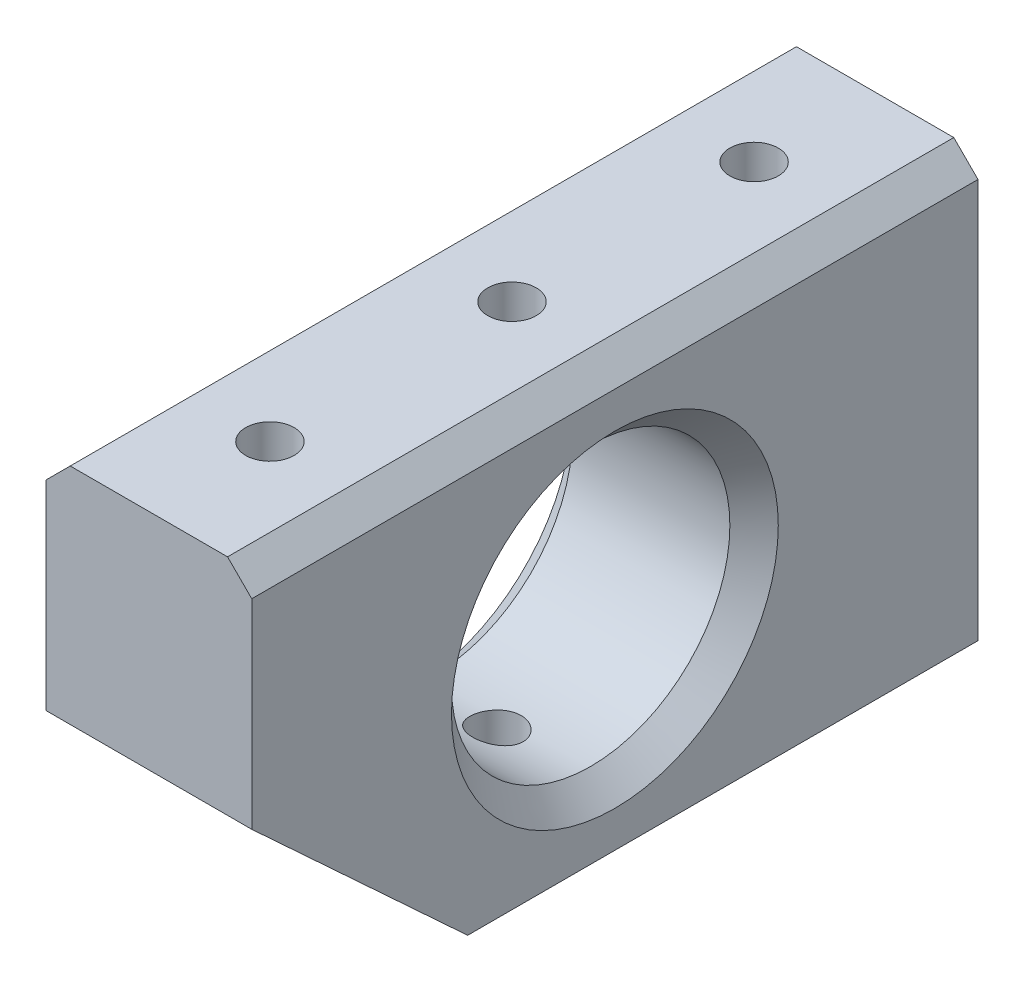
ISO-10303-21;
HEADER;
FILE_DESCRIPTION(('STEP AP214'),'2;1');
FILE_NAME('part.step','',(''),(''),'','','');
FILE_SCHEMA(('AUTOMOTIVE_DESIGN { 1 0 10303 214 1 1 1 1 }'));
ENDSEC;
DATA;
#1=APPLICATION_CONTEXT('core data for automotive mechanical design processes');
#2=APPLICATION_PROTOCOL_DEFINITION('international standard','automotive_design',2000,#1);
#3=PRODUCT_CONTEXT('',#1,'mechanical');
#4=PRODUCT('Part','Part','',(#3));
#5=PRODUCT_RELATED_PRODUCT_CATEGORY('part','',(#4));
#6=PRODUCT_DEFINITION_FORMATION('','',#4);
#7=PRODUCT_DEFINITION_CONTEXT('part definition',#1,'design');
#8=PRODUCT_DEFINITION('design','',#6,#7);
#9=PRODUCT_DEFINITION_SHAPE('','',#8);
#10=(LENGTH_UNIT() NAMED_UNIT(*) SI_UNIT(.MILLI.,.METRE.));
#11=(NAMED_UNIT(*) PLANE_ANGLE_UNIT() SI_UNIT($,.RADIAN.));
#12=(NAMED_UNIT(*) SI_UNIT($,.STERADIAN.) SOLID_ANGLE_UNIT());
#13=UNCERTAINTY_MEASURE_WITH_UNIT(LENGTH_MEASURE(1.E-05),#10,'distance_accuracy_value','');
#14=(GEOMETRIC_REPRESENTATION_CONTEXT(3) GLOBAL_UNCERTAINTY_ASSIGNED_CONTEXT((#13)) GLOBAL_UNIT_ASSIGNED_CONTEXT((#10,
#11,#12)) REPRESENTATION_CONTEXT('',''));
#15=CARTESIAN_POINT('',(0.,0.,0.));
#16=DIRECTION('',(0.,0.,1.));
#17=DIRECTION('',(1.,0.,0.));
#18=AXIS2_PLACEMENT_3D('',#15,#16,#17);
#19=CARTESIAN_POINT('',(0.,0.,76.2));
#20=DIRECTION('',(1.,0.,0.));
#21=DIRECTION('',(0.,0.,-1.));
#22=AXIS2_PLACEMENT_3D('',#19,#20,#21);
#23=PLANE('',#22);
#24=CARTESIAN_POINT('',(0.,23.495,38.1));
#25=DIRECTION('',(1.,0.,0.));
#26=DIRECTION('',(0.,0.,-1.));
#27=AXIS2_PLACEMENT_3D('',#24,#25,#26);
#28=CIRCLE('',#27,17.145);
#29=CARTESIAN_POINT('',(0.,23.495,20.955));
#30=VERTEX_POINT('',#29);
#31=EDGE_CURVE('E170',#30,#30,#28,.T.);
#32=ORIENTED_EDGE('',*,*,#31,.T.);
#33=EDGE_LOOP('',(#32));
#34=FACE_BOUND('',#33,.T.);
#35=DIRECTION('',(0.,-1.,0.));
#36=VECTOR('',#35,1.);
#37=CARTESIAN_POINT('',(0.,0.,76.2));
#38=LINE('',#37,#36);
#39=CARTESIAN_POINT('',(0.,44.45,76.2));
#40=VERTEX_POINT('',#39);
#41=CARTESIAN_POINT('',(0.,23.495,76.2));
#42=VERTEX_POINT('',#41);
#43=EDGE_CURVE('E114',#40,#42,#38,.T.);
#44=ORIENTED_EDGE('',*,*,#43,.F.);
#45=DIRECTION('',(0.,0.,-1.));
#46=VECTOR('',#45,1.);
#47=CARTESIAN_POINT('',(0.,44.45,76.2));
#48=LINE('',#47,#46);
#49=CARTESIAN_POINT('',(0.,44.45,0.));
#50=VERTEX_POINT('',#49);
#51=EDGE_CURVE('E167',#40,#50,#48,.T.);
#52=ORIENTED_EDGE('',*,*,#51,.T.);
#53=DIRECTION('',(0.,-1.,0.));
#54=VECTOR('',#53,1.);
#55=CARTESIAN_POINT('',(0.,0.,0.));
#56=LINE('',#55,#54);
#57=CARTESIAN_POINT('',(0.,2.54000000000001,0.));
#58=VERTEX_POINT('',#57);
#59=EDGE_CURVE('E142',#50,#58,#56,.T.);
#60=ORIENTED_EDGE('',*,*,#59,.T.);
#61=DIRECTION('',(0.,0.,1.));
#62=VECTOR('',#61,1.);
#63=CARTESIAN_POINT('',(0.,2.54000000000001,76.2));
#64=LINE('',#63,#62);
#65=CARTESIAN_POINT('',(0.,2.54000000000001,53.545945945946));
#66=VERTEX_POINT('',#65);
#67=EDGE_CURVE('E134',#58,#66,#64,.T.);
#68=ORIENTED_EDGE('',*,*,#67,.T.);
#69=DIRECTION('',(0.,0.679041981617427,0.734099439586408));
#70=VECTOR('',#69,1.);
#71=CARTESIAN_POINT('',(0.,0.,50.8));
#72=LINE('',#71,#70);
#73=EDGE_CURVE('E131',#66,#42,#72,.T.);
#74=ORIENTED_EDGE('',*,*,#73,.T.);
#75=EDGE_LOOP('',(#44,#52,#60,#68,#74));
#76=FACE_BOUND('',#75,.T.);
#77=ADVANCED_FACE('F41',(#34,#76),#23,.F.);
#78=CARTESIAN_POINT('',(0.,0.,76.2));
#79=DIRECTION('',(0.,1.,0.));
#80=DIRECTION('',(0.,0.,1.));
#81=AXIS2_PLACEMENT_3D('',#78,#79,#80);
#82=PLANE('',#81);
#83=CARTESIAN_POINT('',(10.795,0.,39.6875));
#84=DIRECTION('',(0.,-1.,0.));
#85=DIRECTION('',(0.,0.,-1.));
#86=AXIS2_PLACEMENT_3D('',#83,#84,#85);
#87=CIRCLE('',#86,2.54);
#88=CARTESIAN_POINT('',(10.795,0.,37.1475));
#89=VERTEX_POINT('',#88);
#90=EDGE_CURVE('E352',#89,#89,#87,.T.);
#91=ORIENTED_EDGE('',*,*,#90,.F.);
#92=EDGE_LOOP('',(#91));
#93=FACE_BOUND('',#92,.T.);
#94=CARTESIAN_POINT('',(10.795,0.,12.7));
#95=DIRECTION('',(0.,1.,0.));
#96=DIRECTION('',(0.,0.,1.));
#97=AXIS2_PLACEMENT_3D('',#94,#95,#96);
#98=CIRCLE('',#97,2.54);
#99=CARTESIAN_POINT('',(10.795,0.,15.24));
#100=VERTEX_POINT('',#99);
#101=EDGE_CURVE('E230',#100,#100,#98,.F.);
#102=ORIENTED_EDGE('',*,*,#101,.F.);
#103=EDGE_LOOP('',(#102));
#104=FACE_BOUND('',#103,.T.);
#105=DIRECTION('',(1.,0.,0.));
#106=VECTOR('',#105,1.);
#107=CARTESIAN_POINT('',(0.,0.,50.8));
#108=LINE('',#107,#106);
#109=CARTESIAN_POINT('',(2.54,0.,50.8));
#110=VERTEX_POINT('',#109);
#111=CARTESIAN_POINT('',(19.05,0.,50.8));
#112=VERTEX_POINT('',#111);
#113=EDGE_CURVE('E136',#110,#112,#108,.T.);
#114=ORIENTED_EDGE('',*,*,#113,.F.);
#115=DIRECTION('',(0.,0.,-1.));
#116=VECTOR('',#115,1.);
#117=CARTESIAN_POINT('',(2.54,0.,76.2));
#118=LINE('',#117,#116);
#119=CARTESIAN_POINT('',(2.54,0.,0.));
#120=VERTEX_POINT('',#119);
#121=EDGE_CURVE('E219',#110,#120,#118,.T.);
#122=ORIENTED_EDGE('',*,*,#121,.T.);
#123=DIRECTION('',(1.,0.,0.));
#124=VECTOR('',#123,1.);
#125=CARTESIAN_POINT('',(0.,0.,0.));
#126=LINE('',#125,#124);
#127=CARTESIAN_POINT('',(19.05,0.,0.));
#128=VERTEX_POINT('',#127);
#129=EDGE_CURVE('E146',#120,#128,#126,.T.);
#130=ORIENTED_EDGE('',*,*,#129,.T.);
#131=DIRECTION('',(0.,0.,1.));
#132=VECTOR('',#131,1.);
#133=CARTESIAN_POINT('',(19.05,0.,76.2));
#134=LINE('',#133,#132);
#135=EDGE_CURVE('E58',#128,#112,#134,.T.);
#136=ORIENTED_EDGE('',*,*,#135,.T.);
#137=EDGE_LOOP('',(#114,#122,#130,#136));
#138=FACE_BOUND('',#137,.T.);
#139=ADVANCED_FACE('F235',(#93,#104,#138),#82,.F.);
#140=CARTESIAN_POINT('',(21.59,0.,76.2));
#141=DIRECTION('',(-1.,0.,0.));
#142=DIRECTION('',(0.,0.,1.));
#143=AXIS2_PLACEMENT_3D('',#140,#141,#142);
#144=PLANE('',#143);
#145=CARTESIAN_POINT('',(21.59,23.495,38.1));
#146=DIRECTION('',(-1.,0.,0.));
#147=DIRECTION('',(0.,0.,1.));
#148=AXIS2_PLACEMENT_3D('',#145,#146,#147);
#149=CIRCLE('',#148,17.145);
#150=CARTESIAN_POINT('',(21.59,23.495,55.245));
#151=VERTEX_POINT('',#150);
#152=EDGE_CURVE('E189',#151,#151,#149,.T.);
#153=ORIENTED_EDGE('',*,*,#152,.T.);
#154=EDGE_LOOP('',(#153));
#155=FACE_BOUND('',#154,.T.);
#156=DIRECTION('',(0.,1.,0.));
#157=VECTOR('',#156,1.);
#158=CARTESIAN_POINT('',(21.59,0.,0.));
#159=LINE('',#158,#157);
#160=CARTESIAN_POINT('',(21.59,2.54,0.));
#161=VERTEX_POINT('',#160);
#162=CARTESIAN_POINT('',(21.59,44.45,0.));
#163=VERTEX_POINT('',#162);
#164=EDGE_CURVE('E158',#161,#163,#159,.T.);
#165=ORIENTED_EDGE('',*,*,#164,.T.);
#166=DIRECTION('',(0.,0.,1.));
#167=VECTOR('',#166,1.);
#168=CARTESIAN_POINT('',(21.59,44.45,76.2));
#169=LINE('',#168,#167);
#170=CARTESIAN_POINT('',(21.59,44.45,76.2));
#171=VERTEX_POINT('',#170);
#172=EDGE_CURVE('E186',#163,#171,#169,.T.);
#173=ORIENTED_EDGE('',*,*,#172,.T.);
#174=DIRECTION('',(0.,1.,0.));
#175=VECTOR('',#174,1.);
#176=CARTESIAN_POINT('',(21.59,0.,76.2));
#177=LINE('',#176,#175);
#178=CARTESIAN_POINT('',(21.59,23.495,76.2));
#179=VERTEX_POINT('',#178);
#180=EDGE_CURVE('E128',#179,#171,#177,.T.);
#181=ORIENTED_EDGE('',*,*,#180,.F.);
#182=DIRECTION('',(0.,0.679041981617427,0.734099439586408));
#183=VECTOR('',#182,1.);
#184=CARTESIAN_POINT('',(21.59,0.,50.8));
#185=LINE('',#184,#183);
#186=CARTESIAN_POINT('',(21.59,2.54,53.545945945946));
#187=VERTEX_POINT('',#186);
#188=EDGE_CURVE('E137',#187,#179,#185,.T.);
#189=ORIENTED_EDGE('',*,*,#188,.F.);
#190=DIRECTION('',(0.,0.,-1.));
#191=VECTOR('',#190,1.);
#192=CARTESIAN_POINT('',(21.59,2.54,76.2));
#193=LINE('',#192,#191);
#194=EDGE_CURVE('E182',#187,#161,#193,.T.);
#195=ORIENTED_EDGE('',*,*,#194,.T.);
#196=EDGE_LOOP('',(#165,#173,#181,#189,#195));
#197=FACE_BOUND('',#196,.T.);
#198=ADVANCED_FACE('F227',(#155,#197),#144,.F.);
#199=CARTESIAN_POINT('',(0.,46.99,76.2));
#200=DIRECTION('',(0.,-1.,0.));
#201=DIRECTION('',(0.,0.,-1.));
#202=AXIS2_PLACEMENT_3D('',#199,#200,#201);
#203=PLANE('',#202);
#204=CARTESIAN_POINT('',(10.795,46.99,12.7));
#205=DIRECTION('',(0.,1.,0.));
#206=DIRECTION('',(0.,0.,1.));
#207=AXIS2_PLACEMENT_3D('',#204,#205,#206);
#208=CIRCLE('',#207,2.54);
#209=CARTESIAN_POINT('',(10.795,46.99,15.24));
#210=VERTEX_POINT('',#209);
#211=EDGE_CURVE('E319',#210,#210,#208,.T.);
#212=ORIENTED_EDGE('',*,*,#211,.F.);
#213=EDGE_LOOP('',(#212));
#214=FACE_BOUND('',#213,.T.);
#215=CARTESIAN_POINT('',(10.795,46.99,38.1));
#216=DIRECTION('',(0.,1.,0.));
#217=DIRECTION('',(0.,0.,1.));
#218=AXIS2_PLACEMENT_3D('',#215,#216,#217);
#219=CIRCLE('',#218,2.54);
#220=CARTESIAN_POINT('',(10.795,46.99,40.64));
#221=VERTEX_POINT('',#220);
#222=EDGE_CURVE('E313',#221,#221,#219,.T.);
#223=ORIENTED_EDGE('',*,*,#222,.F.);
#224=EDGE_LOOP('',(#223));
#225=FACE_BOUND('',#224,.T.);
#226=CARTESIAN_POINT('',(10.795,46.99,63.5));
#227=DIRECTION('',(0.,1.,0.));
#228=DIRECTION('',(0.,0.,1.));
#229=AXIS2_PLACEMENT_3D('',#226,#227,#228);
#230=CIRCLE('',#229,2.53999999999999);
#231=CARTESIAN_POINT('',(10.795,46.99,66.04));
#232=VERTEX_POINT('',#231);
#233=EDGE_CURVE('E322',#232,#232,#230,.T.);
#234=ORIENTED_EDGE('',*,*,#233,.F.);
#235=EDGE_LOOP('',(#234));
#236=FACE_BOUND('',#235,.T.);
#237=DIRECTION('',(-1.,0.,0.));
#238=VECTOR('',#237,1.);
#239=CARTESIAN_POINT('',(0.,46.99,0.));
#240=LINE('',#239,#238);
#241=CARTESIAN_POINT('',(19.05,46.99,0.));
#242=VERTEX_POINT('',#241);
#243=CARTESIAN_POINT('',(2.54000000000001,46.99,0.));
#244=VERTEX_POINT('',#243);
#245=EDGE_CURVE('E129',#242,#244,#240,.T.);
#246=ORIENTED_EDGE('',*,*,#245,.T.);
#247=DIRECTION('',(0.,0.,1.));
#248=VECTOR('',#247,1.);
#249=CARTESIAN_POINT('',(2.54000000000001,46.99,76.2));
#250=LINE('',#249,#248);
#251=CARTESIAN_POINT('',(2.54000000000001,46.99,76.2));
#252=VERTEX_POINT('',#251);
#253=EDGE_CURVE('E209',#244,#252,#250,.T.);
#254=ORIENTED_EDGE('',*,*,#253,.T.);
#255=DIRECTION('',(-1.,0.,0.));
#256=VECTOR('',#255,1.);
#257=CARTESIAN_POINT('',(0.,46.99,76.2));
#258=LINE('',#257,#256);
#259=CARTESIAN_POINT('',(19.05,46.99,76.2));
#260=VERTEX_POINT('',#259);
#261=EDGE_CURVE('E153',#260,#252,#258,.T.);
#262=ORIENTED_EDGE('',*,*,#261,.F.);
#263=DIRECTION('',(0.,0.,-1.));
#264=VECTOR('',#263,1.);
#265=CARTESIAN_POINT('',(19.05,46.99,76.2));
#266=LINE('',#265,#264);
#267=EDGE_CURVE('E205',#260,#242,#266,.T.);
#268=ORIENTED_EDGE('',*,*,#267,.T.);
#269=EDGE_LOOP('',(#246,#254,#262,#268));
#270=FACE_BOUND('',#269,.T.);
#271=ADVANCED_FACE('F244',(#214,#225,#236,#270),#203,.F.);
#272=CARTESIAN_POINT('',(0.,0.,76.2));
#273=DIRECTION('',(0.,0.,-1.));
#274=DIRECTION('',(-1.,0.,0.));
#275=AXIS2_PLACEMENT_3D('',#272,#273,#274);
#276=PLANE('',#275);
#277=ORIENTED_EDGE('',*,*,#261,.T.);
#278=DIRECTION('',(0.707106781186548,0.707106781186547,0.));
#279=VECTOR('',#278,1.);
#280=CARTESIAN_POINT('',(0.,44.45,76.2));
#281=LINE('',#280,#279);
#282=EDGE_CURVE('E123',#252,#40,#281,.F.);
#283=ORIENTED_EDGE('',*,*,#282,.T.);
#284=ORIENTED_EDGE('',*,*,#43,.T.);
#285=DIRECTION('',(1.,0.,0.));
#286=VECTOR('',#285,1.);
#287=CARTESIAN_POINT('',(0.,23.495,76.2));
#288=LINE('',#287,#286);
#289=EDGE_CURVE('E120',#42,#179,#288,.T.);
#290=ORIENTED_EDGE('',*,*,#289,.T.);
#291=ORIENTED_EDGE('',*,*,#180,.T.);
#292=DIRECTION('',(0.707106781186545,-0.70710678118655,0.));
#293=VECTOR('',#292,1.);
#294=CARTESIAN_POINT('',(19.05,46.99,76.2));
#295=LINE('',#294,#293);
#296=EDGE_CURVE('E212',#171,#260,#295,.F.);
#297=ORIENTED_EDGE('',*,*,#296,.T.);
#298=EDGE_LOOP('',(#277,#283,#284,#290,#291,#297));
#299=FACE_BOUND('',#298,.T.);
#300=ADVANCED_FACE('F117',(#299),#276,.F.);
#301=CARTESIAN_POINT('',(0.,0.,0.));
#302=DIRECTION('',(0.,0.,-1.));
#303=DIRECTION('',(-1.,0.,0.));
#304=AXIS2_PLACEMENT_3D('',#301,#302,#303);
#305=PLANE('',#304);
#306=ORIENTED_EDGE('',*,*,#59,.F.);
#307=DIRECTION('',(-0.707106781186548,-0.707106781186547,0.));
#308=VECTOR('',#307,1.);
#309=CARTESIAN_POINT('',(-22.225,22.225,0.));
#310=LINE('',#309,#308);
#311=EDGE_CURVE('E202',#50,#244,#310,.F.);
#312=ORIENTED_EDGE('',*,*,#311,.T.);
#313=ORIENTED_EDGE('',*,*,#245,.F.);
#314=DIRECTION('',(-0.707106781186545,0.70710678118655,0.));
#315=VECTOR('',#314,1.);
#316=CARTESIAN_POINT('',(33.0200000000001,33.0199999999998,0.));
#317=LINE('',#316,#315);
#318=EDGE_CURVE('E199',#242,#163,#317,.F.);
#319=ORIENTED_EDGE('',*,*,#318,.T.);
#320=ORIENTED_EDGE('',*,*,#164,.F.);
#321=DIRECTION('',(0.70710678118655,0.707106781186545,0.));
#322=VECTOR('',#321,1.);
#323=CARTESIAN_POINT('',(9.52499999999992,-9.52499999999999,0.));
#324=LINE('',#323,#322);
#325=EDGE_CURVE('E193',#161,#128,#324,.F.);
#326=ORIENTED_EDGE('',*,*,#325,.T.);
#327=ORIENTED_EDGE('',*,*,#129,.F.);
#328=DIRECTION('',(0.707106781186546,-0.707106781186549,0.));
#329=VECTOR('',#328,1.);
#330=CARTESIAN_POINT('',(1.27000000000001,1.27,0.));
#331=LINE('',#330,#329);
#332=EDGE_CURVE('E196',#120,#58,#331,.F.);
#333=ORIENTED_EDGE('',*,*,#332,.T.);
#334=EDGE_LOOP('',(#306,#312,#313,#319,#320,#326,#327,#333));
#335=FACE_BOUND('',#334,.T.);
#336=ADVANCED_FACE('F234',(#335),#305,.T.);
#337=CARTESIAN_POINT('',(0.,23.495,38.1));
#338=DIRECTION('',(1.,0.,0.));
#339=DIRECTION('',(0.,0.,-1.));
#340=AXIS2_PLACEMENT_3D('',#337,#338,#339);
#341=CYLINDRICAL_SURFACE('',#340,14.605);
#342=CARTESIAN_POINT('',(2.54000000000002,23.495,38.1));
#343=DIRECTION('',(1.,0.,0.));
#344=DIRECTION('',(0.,0.,-1.));
#345=AXIS2_PLACEMENT_3D('',#342,#343,#344);
#346=CIRCLE('',#345,14.605);
#347=CARTESIAN_POINT('',(2.54000000000002,23.495,23.495));
#348=VERTEX_POINT('',#347);
#349=EDGE_CURVE('E178',#348,#348,#346,.F.);
#350=ORIENTED_EDGE('',*,*,#349,.T.);
#351=EDGE_LOOP('',(#350));
#352=FACE_BOUND('',#351,.T.);
#353=CARTESIAN_POINT('',(19.05,23.495,38.1));
#354=DIRECTION('',(-1.,0.,0.));
#355=DIRECTION('',(0.,0.,1.));
#356=AXIS2_PLACEMENT_3D('',#353,#354,#355);
#357=CIRCLE('',#356,14.605);
#358=CARTESIAN_POINT('',(19.05,23.495,52.705));
#359=VERTEX_POINT('',#358);
#360=EDGE_CURVE('E174',#359,#359,#357,.F.);
#361=ORIENTED_EDGE('',*,*,#360,.T.);
#362=EDGE_LOOP('',(#361));
#363=FACE_BOUND('',#362,.T.);
#364=CARTESIAN_POINT('',(10.795,8.92109287973881,37.1475));
#365=CARTESIAN_POINT('',(10.6523850935622,8.92109090260096,37.1475054147421));
#366=CARTESIAN_POINT('',(10.5096951637205,8.92028996372938,37.1595490508785));
#367=CARTESIAN_POINT('',(10.2282865074597,8.91728193400107,37.2074109318681));
#368=CARTESIAN_POINT('',(10.0895714176374,8.91507359589412,37.243250265868));
#369=CARTESIAN_POINT('',(9.82018691917144,8.90983279789581,37.3376713072708));
#370=CARTESIAN_POINT('',(9.68951399655673,8.90680070112132,37.3962429990024));
#371=CARTESIAN_POINT('',(9.43986482237357,8.90079030996006,37.5344636485128));
#372=CARTESIAN_POINT('',(9.32088674435303,8.89781200723145,37.6141093078513));
#373=CARTESIAN_POINT('',(9.09781817179331,8.89296884799788,37.7923534907607));
#374=CARTESIAN_POINT('',(8.99374635391311,8.89110537919028,37.8909754343262));
#375=CARTESIAN_POINT('',(8.80363674779435,8.88961197329413,38.1043119946374));
#376=CARTESIAN_POINT('',(8.71759875273139,8.88998201058872,38.2190264267981));
#377=CARTESIAN_POINT('',(8.56635467256365,8.89395802345448,38.46072529695));
#378=CARTESIAN_POINT('',(8.50106158970268,8.89755023699361,38.587655504712));
#379=CARTESIAN_POINT('',(8.39266289947711,8.90870274589156,38.8504923257101));
#380=CARTESIAN_POINT('',(8.3495557874361,8.91626277207881,38.9863983294925));
#381=CARTESIAN_POINT('',(8.28690324532205,8.93566177641183,39.2621768171101));
#382=CARTESIAN_POINT('',(8.26718659686202,8.94746882523413,39.4020127093658));
#383=CARTESIAN_POINT('',(8.25112017498849,8.9753135657713,39.6825947979877));
#384=CARTESIAN_POINT('',(8.25477080812071,8.99135133108785,39.8233410101491));
#385=CARTESIAN_POINT('',(8.28518511586819,9.02724881269866,40.1025267976475));
#386=CARTESIAN_POINT('',(8.31206408295948,9.04712720900944,40.2409513503427));
#387=CARTESIAN_POINT('',(8.38812813428445,9.08974076150076,40.5110671134375));
#388=CARTESIAN_POINT('',(8.43731605827329,9.11247628110424,40.6427574642505));
#389=CARTESIAN_POINT('',(8.55778700749539,9.16004731510226,40.8986521442471));
#390=CARTESIAN_POINT('',(8.62950783102445,9.18491664434546,41.0226441123324));
#391=CARTESIAN_POINT('',(8.79271934569216,9.23475109336981,41.2568471847537));
#392=CARTESIAN_POINT('',(8.88421270308773,9.25971622562327,41.3670564273701));
#393=CARTESIAN_POINT('',(9.0861149596177,9.30836142817523,41.5722635031265));
#394=CARTESIAN_POINT('',(9.19678481657527,9.33201688010012,41.667010871152));
#395=CARTESIAN_POINT('',(9.43315539761811,9.37577838194324,41.8364811132878));
#396=CARTESIAN_POINT('',(9.55885479706364,9.39588474427685,41.9112057502375));
#397=CARTESIAN_POINT('',(9.81970399998482,9.43054854959243,42.0371883277382));
#398=CARTESIAN_POINT('',(9.95466945718547,9.44518997754032,42.0888041074723));
#399=CARTESIAN_POINT('',(10.2318931204709,9.46805513327691,42.1684866877494));
#400=CARTESIAN_POINT('',(10.3741493144607,9.47628062167828,42.196559948808));
#401=CARTESIAN_POINT('',(10.6563273107826,9.4853701472308,42.2275351273953));
#402=CARTESIAN_POINT('',(10.7961444106855,9.48649224359478,42.2313195086325));
#403=CARTESIAN_POINT('',(11.0743871795782,9.48196253051675,42.215928713572));
#404=CARTESIAN_POINT('',(11.2128129805263,9.47631136971887,42.1967557357966));
#405=CARTESIAN_POINT('',(11.482196570189,9.45887592192606,42.136606709945));
#406=CARTESIAN_POINT('',(11.6132358772529,9.44718613791122,42.0959664053007));
#407=CARTESIAN_POINT('',(11.866609346728,9.41869831174642,41.9944217050089));
#408=CARTESIAN_POINT('',(11.9889424989397,9.40189967799097,41.9335149624283));
#409=CARTESIAN_POINT('',(12.2246358573047,9.3640470223518,41.7915709102957));
#410=CARTESIAN_POINT('',(12.3377134570969,9.34290129468409,41.7100892776523));
#411=CARTESIAN_POINT('',(12.5488047596616,9.29819363459787,41.5300585396973));
#412=CARTESIAN_POINT('',(12.6468154819048,9.27463122564454,41.4315060656118));
#413=CARTESIAN_POINT('',(12.8285532759888,9.22586657648811,41.2161584193023));
#414=CARTESIAN_POINT('',(12.9116592698586,9.2006358066947,41.0988448966066));
#415=CARTESIAN_POINT('',(13.0570008721162,9.15102180094321,40.8517589862743));
#416=CARTESIAN_POINT('',(13.1192348958575,9.1266386294626,40.7219856536229));
#417=CARTESIAN_POINT('',(13.2215376537948,9.0799810989352,40.4520591402333));
#418=CARTESIAN_POINT('',(13.2613762590174,9.05773051634326,40.3118143906709));
#419=CARTESIAN_POINT('',(13.3165341697871,9.01684109332604,40.0260716648814));
#420=CARTESIAN_POINT('',(13.3318562644013,8.99820184227763,39.8805742881338));
#421=CARTESIAN_POINT('',(13.3372217290619,8.96561486602611,39.5912433071892));
#422=CARTESIAN_POINT('',(13.3277155494956,8.95158866781457,39.4474269537599));
#423=CARTESIAN_POINT('',(13.2844361996651,8.92804592829446,39.1631178089595));
#424=CARTESIAN_POINT('',(13.250665689854,8.91852889277034,39.0226246549618));
#425=CARTESIAN_POINT('',(13.1605828690117,8.90393061056502,38.7517600100463));
#426=CARTESIAN_POINT('',(13.1047045059029,8.89876963861714,38.6212482490601));
#427=CARTESIAN_POINT('',(12.9719663222004,8.89198373776263,38.3712772221521));
#428=CARTESIAN_POINT('',(12.8951071597858,8.89035869794622,38.2518176096758));
#429=CARTESIAN_POINT('',(12.722693966422,8.88974900730196,38.0275050630407));
#430=CARTESIAN_POINT('',(12.6271645952085,8.89076089511352,37.9226331707274));
#431=CARTESIAN_POINT('',(12.4200012546775,8.89436406060271,37.7302163370409));
#432=CARTESIAN_POINT('',(12.3083637490635,8.89695568549156,37.6426752104108));
#433=CARTESIAN_POINT('',(12.0711448900178,8.90267029121105,37.486733784723));
#434=CARTESIAN_POINT('',(11.9454571335692,8.90579743754694,37.4184955965695));
#435=CARTESIAN_POINT('',(11.6844913009257,8.91158988294364,37.3040845568295));
#436=CARTESIAN_POINT('',(11.5492216843442,8.91425558241714,37.2578925132852));
#437=CARTESIAN_POINT('',(11.3104665305615,8.91784755983891,37.1981878842552));
#438=CARTESIAN_POINT('',(11.2083164931224,8.91904955285242,37.1792088683272));
#439=CARTESIAN_POINT('',(11.0024575364484,8.92067293123741,37.1538629683398));
#440=CARTESIAN_POINT('',(10.8987486201016,8.92109431805495,37.1474960609165));
#441=CARTESIAN_POINT('',(10.795,8.92109287973881,37.1475));
#442=B_SPLINE_CURVE_WITH_KNOTS('',3,(#364,#365,#366,#367,#368,#369,#370,#371,#372,#373,#374,
#375,#376,#377,#378,#379,#380,#381,#382,#383,#384,#385,#386,#387,#388,#389,#390,#391,#392,#393,
#394,#395,#396,#397,#398,#399,#400,#401,#402,#403,#404,#405,#406,#407,#408,#409,#410,#411,#412,
#413,#414,#415,#416,#417,#418,#419,#420,#421,#422,#423,#424,#425,#426,#427,#428,#429,#430,#431,
#432,#433,#434,#435,#436,#437,#438,#439,#440,#441),.UNSPECIFIED.,.T.,.F.,(4,2,2,2,2,2,2,2,2,2,2,
2,2,2,2,2,2,2,2,2,2,2,2,2,2,2,2,2,2,2,2,2,2,2,2,2,2,2,4),(0.,0.42746901178995,0.855317378352818,
1.28297745239856,1.7105706298004,2.13869495534646,2.56681437059688,2.99311393328661,
3.41938458007034,3.84251528117365,4.2656533439568,4.69090376965294,5.11620834159056,
5.55034866068417,5.9845475586483,6.42520070044189,6.86581503353665,7.29934813731804,
7.73276223239302,8.15033590011241,8.56786958189079,8.97905848559487,9.3902950231718,
9.81131220368843,10.2324125629342,10.6682730791309,11.1041666793425,11.5444611496465,
11.9847055272524,12.417018425231,12.8492839296633,13.2734550466627,13.6976128587108,
14.1212141809401,14.5449086403075,14.9720623573748,15.3988435405095,15.7098166594786,
16.0207892023716),.UNSPECIFIED.);
#443=CARTESIAN_POINT('',(10.795,8.92109287973881,37.1475));
#444=VERTEX_POINT('',#443);
#445=EDGE_CURVE('E307',#444,#444,#442,.T.);
#446=ORIENTED_EDGE('',*,*,#445,.F.);
#447=EDGE_LOOP('',(#446));
#448=FACE_BOUND('',#447,.T.);
#449=CARTESIAN_POINT('',(10.795,37.8774345991908,40.64));
#450=CARTESIAN_POINT('',(10.6534894613377,37.877437225139,40.639994394187));
#451=CARTESIAN_POINT('',(10.5119039330996,37.8795457581309,40.6281340003201));
#452=CARTESIAN_POINT('',(10.2327121133975,37.8877434460224,40.5810302035264));
#453=CARTESIAN_POINT('',(10.0951095087486,37.8938361731489,40.545765816165));
#454=CARTESIAN_POINT('',(9.82796416411036,37.9092917962681,40.4529586647047));
#455=CARTESIAN_POINT('',(9.69841454316152,37.9186518539164,40.3954352324445));
#456=CARTESIAN_POINT('',(9.45081724766371,37.939584141011,40.2597920960115));
#457=CARTESIAN_POINT('',(9.33276841411124,37.9511561471972,40.1816744701859));
#458=CARTESIAN_POINT('',(9.11024559996051,37.9753470846111,40.0061671779378));
#459=CARTESIAN_POINT('',(9.00591283702061,37.9879750008682,39.9085996771568));
#460=CARTESIAN_POINT('',(8.81501165534651,38.0127752512497,39.6973465669794));
#461=CARTESIAN_POINT('',(8.72844432649516,38.0249475573857,39.5836599694234));
#462=CARTESIAN_POINT('',(8.57499750008719,38.0475605956396,39.3424764633757));
#463=CARTESIAN_POINT('',(8.50825002264873,38.057989522675,39.2148943590605));
#464=CARTESIAN_POINT('',(8.39718684994073,38.0758405568064,38.9501166602087));
#465=CARTESIAN_POINT('',(8.35286956758827,38.0832628766321,38.8129217466233));
#466=CARTESIAN_POINT('',(8.28835834623439,38.094200960219,38.534273494058));
#467=CARTESIAN_POINT('',(8.26792684473814,38.0977551703508,38.392876688244));
#468=CARTESIAN_POINT('',(8.2510279420762,38.1006888066046,38.1086203204646));
#469=CARTESIAN_POINT('',(8.2545587739559,38.1000685405477,37.9657608671288));
#470=CARTESIAN_POINT('',(8.28530007382919,38.0947534150953,37.6842603757787));
#471=CARTESIAN_POINT('',(8.31225483545621,38.0901025569858,37.5455904632985));
#472=CARTESIAN_POINT('',(8.38867560795726,38.077297963488,37.274772312283));
#473=CARTESIAN_POINT('',(8.43814235126309,38.0691441141297,37.1426242860936));
#474=CARTESIAN_POINT('',(8.55843350201919,38.0501752302267,36.8878469391134));
#475=CARTESIAN_POINT('',(8.6293622165929,38.0393472474917,36.7652678694682));
#476=CARTESIAN_POINT('',(8.79048734450471,38.0162312723324,36.5336555514707));
#477=CARTESIAN_POINT('',(8.88068545203165,38.0039431515731,36.4246234955227));
#478=CARTESIAN_POINT('',(9.07920420096749,37.9790801482294,36.2216879580677));
#479=CARTESIAN_POINT('',(9.18774841624426,37.9665036216447,36.1280032544731));
#480=CARTESIAN_POINT('',(9.41912778661217,37.9426375758928,35.9601392077568));
#481=CARTESIAN_POINT('',(9.54196309725268,37.9313480707366,35.8859600769694));
#482=CARTESIAN_POINT('',(9.79870366541938,37.9113329146698,35.7591634136972));
#483=CARTESIAN_POINT('',(9.93262310857349,37.9026106164012,35.7065740412842));
#484=CARTESIAN_POINT('',(10.2075812744332,37.8887714228487,35.6246999785617));
#485=CARTESIAN_POINT('',(10.3486193093797,37.883654179976,35.5954130414649));
#486=CARTESIAN_POINT('',(10.6318484906622,37.8776722753731,35.5612870522335));
#487=CARTESIAN_POINT('',(10.7740008488125,37.8767532271219,35.5561353123443));
#488=CARTESIAN_POINT('',(11.0571358983939,37.8791266826915,35.5695910382285));
#489=CARTESIAN_POINT('',(11.198118638954,37.8824190087053,35.5881975009148));
#490=CARTESIAN_POINT('',(11.4739076194749,37.8927938641105,35.6483742378865));
#491=CARTESIAN_POINT('',(11.6087500223963,37.8998498506087,35.6897837609698));
#492=CARTESIAN_POINT('',(11.8695818979836,37.9169345254547,35.7942219049687));
#493=CARTESIAN_POINT('',(11.9955707985091,37.9269634057018,35.8572519215213));
#494=CARTESIAN_POINT('',(12.236506231926,37.9489893947989,36.0038736919739));
#495=CARTESIAN_POINT('',(12.3513296642266,37.9610051932154,36.0876648712792));
#496=CARTESIAN_POINT('',(12.5653987002631,37.9855971906442,36.2731583433482));
#497=CARTESIAN_POINT('',(12.6646431057626,37.9981734326665,36.3748620125475));
#498=CARTESIAN_POINT('',(12.8458875417163,38.0226422473539,36.5946826049573));
#499=CARTESIAN_POINT('',(12.9276784449127,38.0345254095078,36.7129731642737));
#500=CARTESIAN_POINT('',(13.0702256084138,38.0561157887693,36.9617977655555));
#501=CARTESIAN_POINT('',(13.1309825947014,38.0658230809726,37.0923313847555));
#502=CARTESIAN_POINT('',(13.2294159453592,38.0819272148172,37.3613300915254));
#503=CARTESIAN_POINT('',(13.267199477517,38.0883394055736,37.4997550050985));
#504=CARTESIAN_POINT('',(13.3189575118369,38.097195949435,37.7811066274819));
#505=CARTESIAN_POINT('',(13.3329341549744,38.0996406593384,37.9240329303005));
#506=CARTESIAN_POINT('',(13.3366157111614,38.1002810586663,38.2083161240717));
#507=CARTESIAN_POINT('',(13.326638017423,38.0985323114513,38.3496688791817));
#508=CARTESIAN_POINT('',(13.2833835294766,38.0910963905044,38.6286521783982));
#509=CARTESIAN_POINT('',(13.2501068949639,38.085409243767,38.7662827480104));
#510=CARTESIAN_POINT('',(13.1613250250405,38.0707338972076,39.033777959725));
#511=CARTESIAN_POINT('',(13.105849073515,38.0617500474706,39.163652574612));
#512=CARTESIAN_POINT('',(12.9742795135096,38.0414592351997,39.4122988710915));
#513=CARTESIAN_POINT('',(12.8981847890565,38.0301521469306,39.5310699512467));
#514=CARTESIAN_POINT('',(12.7264233896014,38.006289330988,39.7557309646829));
#515=CARTESIAN_POINT('',(12.6305252963483,37.9937198354236,39.8614425278039));
#516=CARTESIAN_POINT('',(12.4223634734343,37.968841298241,40.0553842597325));
#517=CARTESIAN_POINT('',(12.3100959138636,37.9565323183487,40.1436103260881));
#518=CARTESIAN_POINT('',(12.0713412347266,37.933464580246,40.300712934711));
#519=CARTESIAN_POINT('',(11.9447502349535,37.9227186344235,40.3694335187338));
#520=CARTESIAN_POINT('',(11.6816818555817,37.9041458889107,40.4845265586458));
#521=CARTESIAN_POINT('',(11.5452143233369,37.8963162281624,40.530920931067));
#522=CARTESIAN_POINT('',(11.3060471524399,37.8861645030813,40.5901837335398));
#523=CARTESIAN_POINT('',(11.2047805271339,37.882909400062,40.6088341890727));
#524=CARTESIAN_POINT('',(11.0006891206188,37.8785435161615,40.6337442300217));
#525=CARTESIAN_POINT('',(10.89786437208,37.8774326903823,40.6400040748798));
#526=CARTESIAN_POINT('',(10.795,37.8774345991908,40.64));
#527=B_SPLINE_CURVE_WITH_KNOTS('',3,(#449,#450,#451,#452,#453,#454,#455,#456,#457,#458,#459,
#460,#461,#462,#463,#464,#465,#466,#467,#468,#469,#470,#471,#472,#473,#474,#475,#476,#477,#478,
#479,#480,#481,#482,#483,#484,#485,#486,#487,#488,#489,#490,#491,#492,#493,#494,#495,#496,#497,
#498,#499,#500,#501,#502,#503,#504,#505,#506,#507,#508,#509,#510,#511,#512,#513,#514,#515,#516,
#517,#518,#519,#520,#521,#522,#523,#524,#525,#526),.UNSPECIFIED.,.T.,.F.,(4,2,2,2,2,2,2,2,2,2,2,
2,2,2,2,2,2,2,2,2,2,2,2,2,2,2,2,2,2,2,2,2,2,2,2,2,2,2,4),(0.,0.42415536979697,0.848691559522952,
1.27285986682514,1.69698538382382,2.12518303293323,2.55340694348122,2.98442236882532,
3.41540729274565,3.84206825590902,4.2686977579306,4.69072766274841,5.11277129937503,
5.53689998181104,5.96106596952255,6.39083290295972,6.8206045145712,7.25093492077063,
7.68122383010227,8.10592234897721,8.53060293738945,8.95232735122339,9.37407899316052,
9.80005057776811,10.2260549092749,10.6569079057873,11.0877460299821,11.5165586219057,
11.9453326482854,12.3684568729456,12.7915781974634,13.2141431983556,13.6367310747833,
14.064569230735,14.4925076476665,14.9237770520301,15.3546222326626,15.6629483105683,
15.9712679324916),.UNSPECIFIED.);
#528=CARTESIAN_POINT('',(10.795,37.8774345991908,40.64));
#529=VERTEX_POINT('',#528);
#530=EDGE_CURVE('E310',#529,#529,#527,.T.);
#531=ORIENTED_EDGE('',*,*,#530,.F.);
#532=EDGE_LOOP('',(#531));
#533=FACE_BOUND('',#532,.T.);
#534=ADVANCED_FACE('F299',(#352,#363,#448,#533),#341,.F.);
#535=CARTESIAN_POINT('',(0.,0.,50.8));
#536=DIRECTION('',(0.,0.734099439586408,-0.679041981617427));
#537=DIRECTION('',(0.,0.679041981617427,0.734099439586408));
#538=AXIS2_PLACEMENT_3D('',#535,#536,#537);
#539=PLANE('',#538);
#540=CARTESIAN_POINT('',(10.795,11.7475,63.5));
#541=DIRECTION('',(0.,0.734099439586408,-0.679041981617427));
#542=DIRECTION('',(0.,0.679041981617427,0.734099439586408));
#543=AXIS2_PLACEMENT_3D('',#540,#541,#542);
#544=ELLIPSE('',#543,3.46002171235961,2.53999999999999);
#545=CARTESIAN_POINT('',(10.795,14.097,66.04));
#546=VERTEX_POINT('',#545);
#547=EDGE_CURVE('E314',#546,#546,#544,.F.);
#548=ORIENTED_EDGE('',*,*,#547,.F.);
#549=EDGE_LOOP('',(#548));
#550=FACE_BOUND('',#549,.T.);
#551=ORIENTED_EDGE('',*,*,#73,.F.);
#552=DIRECTION('',(-0.561767939698273,0.561767939698276,0.607316691565704));
#553=VECTOR('',#552,1.);
#554=CARTESIAN_POINT('',(-6.12574458275701,8.66574458275706,60.1683725218995));
#555=LINE('',#554,#553);
#556=EDGE_CURVE('E11',#66,#110,#555,.F.);
#557=ORIENTED_EDGE('',*,*,#556,.T.);
#558=ORIENTED_EDGE('',*,*,#113,.T.);
#559=DIRECTION('',(-0.561767939698278,-0.561767939698274,-0.607316691565701));
#560=VECTOR('',#559,1.);
#561=CARTESIAN_POINT('',(29.3189073305671,10.268907330567,61.9015214384509));
#562=LINE('',#561,#560);
#563=EDGE_CURVE('E51',#112,#187,#562,.F.);
#564=ORIENTED_EDGE('',*,*,#563,.T.);
#565=ORIENTED_EDGE('',*,*,#188,.T.);
#566=ORIENTED_EDGE('',*,*,#289,.F.);
#567=EDGE_LOOP('',(#551,#557,#558,#564,#565,#566));
#568=FACE_BOUND('',#567,.T.);
#569=ADVANCED_FACE('F139',(#550,#568),#539,.F.);
#570=CARTESIAN_POINT('',(10.795,-0.001000000000001,63.5));
#571=DIRECTION('',(0.,1.,0.));
#572=DIRECTION('',(0.,0.,1.));
#573=AXIS2_PLACEMENT_3D('',#570,#571,#572);
#574=CYLINDRICAL_SURFACE('',#573,2.53999999999999);
#575=ORIENTED_EDGE('',*,*,#233,.T.);
#576=EDGE_LOOP('',(#575));
#577=FACE_BOUND('',#576,.T.);
#578=ORIENTED_EDGE('',*,*,#547,.T.);
#579=EDGE_LOOP('',(#578));
#580=FACE_BOUND('',#579,.T.);
#581=ADVANCED_FACE('F373',(#577,#580),#574,.F.);
#582=CARTESIAN_POINT('',(10.795,-0.001000000000001,38.1));
#583=DIRECTION('',(0.,1.,0.));
#584=DIRECTION('',(0.,0.,1.));
#585=AXIS2_PLACEMENT_3D('',#582,#583,#584);
#586=CYLINDRICAL_SURFACE('',#585,2.54);
#587=ORIENTED_EDGE('',*,*,#222,.T.);
#588=EDGE_LOOP('',(#587));
#589=FACE_BOUND('',#588,.T.);
#590=ORIENTED_EDGE('',*,*,#530,.T.);
#591=EDGE_LOOP('',(#590));
#592=FACE_BOUND('',#591,.T.);
#593=ADVANCED_FACE('F332',(#589,#592),#586,.F.);
#594=CARTESIAN_POINT('',(10.795,-0.001000000000001,12.7));
#595=DIRECTION('',(0.,1.,0.));
#596=DIRECTION('',(0.,0.,1.));
#597=AXIS2_PLACEMENT_3D('',#594,#595,#596);
#598=CYLINDRICAL_SURFACE('',#597,2.54);
#599=ORIENTED_EDGE('',*,*,#211,.T.);
#600=EDGE_LOOP('',(#599));
#601=FACE_BOUND('',#600,.T.);
#602=ORIENTED_EDGE('',*,*,#101,.T.);
#603=EDGE_LOOP('',(#602));
#604=FACE_BOUND('',#603,.T.);
#605=ADVANCED_FACE('F337',(#601,#604),#598,.F.);
#606=CARTESIAN_POINT('',(10.795,46.991,39.6875));
#607=DIRECTION('',(0.,-1.,0.));
#608=DIRECTION('',(0.,0.,-1.));
#609=AXIS2_PLACEMENT_3D('',#606,#607,#608);
#610=CYLINDRICAL_SURFACE('',#609,2.54);
#611=ORIENTED_EDGE('',*,*,#90,.T.);
#612=EDGE_LOOP('',(#611));
#613=FACE_BOUND('',#612,.T.);
#614=ORIENTED_EDGE('',*,*,#445,.T.);
#615=EDGE_LOOP('',(#614));
#616=FACE_BOUND('',#615,.T.);
#617=ADVANCED_FACE('F277',(#613,#616),#610,.F.);
#618=CARTESIAN_POINT('',(0.,23.495,38.1));
#619=DIRECTION('',(-1.,0.,0.));
#620=DIRECTION('',(0.,0.,1.));
#621=AXIS2_PLACEMENT_3D('',#618,#619,#620);
#622=CONICAL_SURFACE('',#621,17.145,0.785398163397448);
#623=ORIENTED_EDGE('',*,*,#349,.F.);
#624=EDGE_LOOP('',(#623));
#625=FACE_BOUND('',#624,.T.);
#626=ORIENTED_EDGE('',*,*,#31,.F.);
#627=EDGE_LOOP('',(#626));
#628=FACE_BOUND('',#627,.T.);
#629=ADVANCED_FACE('F271',(#625,#628),#622,.F.);
#630=CARTESIAN_POINT('',(19.05,23.495,38.1));
#631=DIRECTION('',(1.,0.,0.));
#632=DIRECTION('',(0.,0.,-1.));
#633=AXIS2_PLACEMENT_3D('',#630,#631,#632);
#634=CONICAL_SURFACE('',#633,14.605,0.785398163397451);
#635=ORIENTED_EDGE('',*,*,#152,.F.);
#636=EDGE_LOOP('',(#635));
#637=FACE_BOUND('',#636,.T.);
#638=ORIENTED_EDGE('',*,*,#360,.F.);
#639=EDGE_LOOP('',(#638));
#640=FACE_BOUND('',#639,.T.);
#641=ADVANCED_FACE('F257',(#637,#640),#634,.F.);
#642=CARTESIAN_POINT('',(0.,44.45,76.2));
#643=DIRECTION('',(0.707106781186547,-0.707106781186548,0.));
#644=DIRECTION('',(0.,0.,-1.));
#645=AXIS2_PLACEMENT_3D('',#642,#643,#644);
#646=PLANE('',#645);
#647=ORIENTED_EDGE('',*,*,#282,.F.);
#648=ORIENTED_EDGE('',*,*,#253,.F.);
#649=ORIENTED_EDGE('',*,*,#311,.F.);
#650=ORIENTED_EDGE('',*,*,#51,.F.);
#651=EDGE_LOOP('',(#647,#648,#649,#650));
#652=FACE_BOUND('',#651,.T.);
#653=ADVANCED_FACE('F240',(#652),#646,.F.);
#654=CARTESIAN_POINT('',(19.05,46.99,76.2));
#655=DIRECTION('',(-0.70710678118655,-0.707106781186545,0.));
#656=DIRECTION('',(0.,0.,-1.));
#657=AXIS2_PLACEMENT_3D('',#654,#655,#656);
#658=PLANE('',#657);
#659=ORIENTED_EDGE('',*,*,#296,.F.);
#660=ORIENTED_EDGE('',*,*,#172,.F.);
#661=ORIENTED_EDGE('',*,*,#318,.F.);
#662=ORIENTED_EDGE('',*,*,#267,.F.);
#663=EDGE_LOOP('',(#659,#660,#661,#662));
#664=FACE_BOUND('',#663,.T.);
#665=ADVANCED_FACE('F249',(#664),#658,.F.);
#666=CARTESIAN_POINT('',(2.54,0.,76.2));
#667=DIRECTION('',(0.707106781186549,0.707106781186546,0.));
#668=DIRECTION('',(0.,0.,-1.));
#669=AXIS2_PLACEMENT_3D('',#666,#667,#668);
#670=PLANE('',#669);
#671=ORIENTED_EDGE('',*,*,#556,.F.);
#672=ORIENTED_EDGE('',*,*,#67,.F.);
#673=ORIENTED_EDGE('',*,*,#332,.F.);
#674=ORIENTED_EDGE('',*,*,#121,.F.);
#675=EDGE_LOOP('',(#671,#672,#673,#674));
#676=FACE_BOUND('',#675,.T.);
#677=ADVANCED_FACE('F238',(#676),#670,.F.);
#678=CARTESIAN_POINT('',(21.59,2.54,76.2));
#679=DIRECTION('',(-0.707106781186545,0.70710678118655,0.));
#680=DIRECTION('',(0.,0.,-1.));
#681=AXIS2_PLACEMENT_3D('',#678,#679,#680);
#682=PLANE('',#681);
#683=ORIENTED_EDGE('',*,*,#563,.F.);
#684=ORIENTED_EDGE('',*,*,#135,.F.);
#685=ORIENTED_EDGE('',*,*,#325,.F.);
#686=ORIENTED_EDGE('',*,*,#194,.F.);
#687=EDGE_LOOP('',(#683,#684,#685,#686));
#688=FACE_BOUND('',#687,.T.);
#689=ADVANCED_FACE('F44',(#688),#682,.F.);
#690=CLOSED_SHELL('',(#77,#139,#198,#271,#300,#336,#534,#569,#581,#593,#605,#617,#629,#641,#653,
#665,#677,#689));
#691=MANIFOLD_SOLID_BREP('B2',#690);
#692=ADVANCED_BREP_SHAPE_REPRESENTATION('',(#18,#691),#14);
#693=SHAPE_DEFINITION_REPRESENTATION(#9,#692);
ENDSEC;
END-ISO-10303-21;
